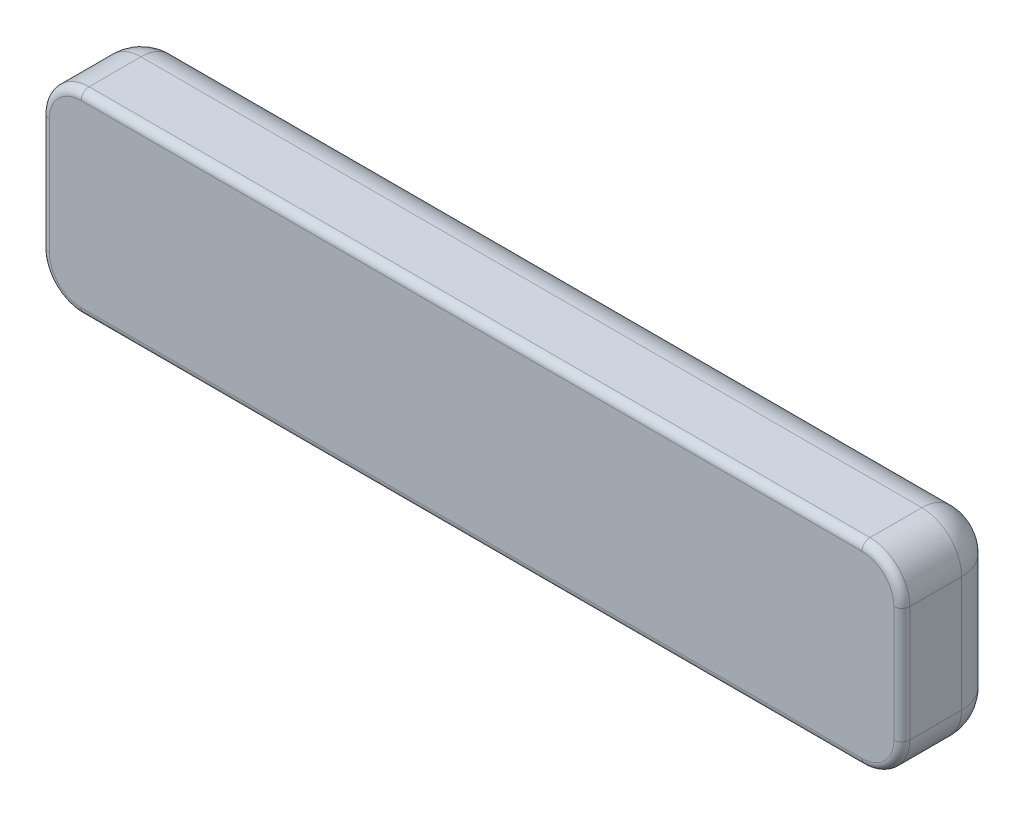
ISO-10303-21;
HEADER;
FILE_DESCRIPTION(('STEP AP214'),'2;1');
FILE_NAME('part.step','',(''),(''),'','','');
FILE_SCHEMA(('AUTOMOTIVE_DESIGN { 1 0 10303 214 1 1 1 1 }'));
ENDSEC;
DATA;
#1=APPLICATION_CONTEXT('core data for automotive mechanical design processes');
#2=APPLICATION_PROTOCOL_DEFINITION('international standard','automotive_design',2000,#1);
#3=PRODUCT_CONTEXT('',#1,'mechanical');
#4=PRODUCT('Part','Part','',(#3));
#5=PRODUCT_RELATED_PRODUCT_CATEGORY('part','',(#4));
#6=PRODUCT_DEFINITION_FORMATION('','',#4);
#7=PRODUCT_DEFINITION_CONTEXT('part definition',#1,'design');
#8=PRODUCT_DEFINITION('design','',#6,#7);
#9=PRODUCT_DEFINITION_SHAPE('','',#8);
#10=(LENGTH_UNIT() NAMED_UNIT(*) SI_UNIT(.MILLI.,.METRE.));
#11=(NAMED_UNIT(*) PLANE_ANGLE_UNIT() SI_UNIT($,.RADIAN.));
#12=(NAMED_UNIT(*) SI_UNIT($,.STERADIAN.) SOLID_ANGLE_UNIT());
#13=UNCERTAINTY_MEASURE_WITH_UNIT(LENGTH_MEASURE(1.E-05),#10,'distance_accuracy_value','');
#14=(GEOMETRIC_REPRESENTATION_CONTEXT(3) GLOBAL_UNCERTAINTY_ASSIGNED_CONTEXT((#13)) GLOBAL_UNIT_ASSIGNED_CONTEXT((#10,
#11,#12)) REPRESENTATION_CONTEXT('',''));
#15=CARTESIAN_POINT('',(0.,0.,0.));
#16=DIRECTION('',(0.,0.,1.));
#17=DIRECTION('',(1.,0.,0.));
#18=AXIS2_PLACEMENT_3D('',#15,#16,#17);
#19=CARTESIAN_POINT('',(54.,-12.25,12.5));
#20=DIRECTION('',(-1.,0.,0.));
#21=DIRECTION('',(0.,0.,1.));
#22=AXIS2_PLACEMENT_3D('',#19,#20,#21);
#23=PLANE('',#22);
#24=DIRECTION('',(0.,0.,-1.));
#25=VECTOR('',#24,1.);
#26=CARTESIAN_POINT('',(54.,7.25,12.5));
#27=LINE('',#26,#25);
#28=CARTESIAN_POINT('',(54.,7.25,5.));
#29=VERTEX_POINT('',#28);
#30=CARTESIAN_POINT('',(54.,7.25,11.5));
#31=VERTEX_POINT('',#30);
#32=EDGE_CURVE('E214',#29,#31,#27,.F.);
#33=ORIENTED_EDGE('',*,*,#32,.T.);
#34=DIRECTION('',(0.,1.,0.));
#35=VECTOR('',#34,1.);
#36=CARTESIAN_POINT('',(54.,-12.25,11.5));
#37=LINE('',#36,#35);
#38=CARTESIAN_POINT('',(54.,-7.25,11.5));
#39=VERTEX_POINT('',#38);
#40=EDGE_CURVE('E44',#31,#39,#37,.F.);
#41=ORIENTED_EDGE('',*,*,#40,.T.);
#42=DIRECTION('',(0.,0.,-1.));
#43=VECTOR('',#42,1.);
#44=CARTESIAN_POINT('',(54.,-7.25,12.5));
#45=LINE('',#44,#43);
#46=CARTESIAN_POINT('',(54.,-7.25,5.));
#47=VERTEX_POINT('',#46);
#48=EDGE_CURVE('E216',#39,#47,#45,.T.);
#49=ORIENTED_EDGE('',*,*,#48,.T.);
#50=DIRECTION('',(0.,1.,0.));
#51=VECTOR('',#50,1.);
#52=CARTESIAN_POINT('',(54.,12.25,5.));
#53=LINE('',#52,#51);
#54=EDGE_CURVE('E181',#47,#29,#53,.T.);
#55=ORIENTED_EDGE('',*,*,#54,.T.);
#56=EDGE_LOOP('',(#33,#41,#49,#55));
#57=FACE_BOUND('',#56,.T.);
#58=ADVANCED_FACE('F35',(#57),#23,.F.);
#59=CARTESIAN_POINT('',(-54.,12.25,12.5));
#60=DIRECTION('',(0.,-1.,0.));
#61=DIRECTION('',(0.,0.,-1.));
#62=AXIS2_PLACEMENT_3D('',#59,#60,#61);
#63=PLANE('',#62);
#64=DIRECTION('',(0.,0.,-1.));
#65=VECTOR('',#64,1.);
#66=CARTESIAN_POINT('',(-49.,12.25,12.5));
#67=LINE('',#66,#65);
#68=CARTESIAN_POINT('',(-49.,12.25,5.));
#69=VERTEX_POINT('',#68);
#70=CARTESIAN_POINT('',(-49.,12.25,11.5));
#71=VERTEX_POINT('',#70);
#72=EDGE_CURVE('E211',#69,#71,#67,.F.);
#73=ORIENTED_EDGE('',*,*,#72,.T.);
#74=DIRECTION('',(-1.,0.,0.));
#75=VECTOR('',#74,1.);
#76=CARTESIAN_POINT('',(-54.,12.25,11.5));
#77=LINE('',#76,#75);
#78=CARTESIAN_POINT('',(49.,12.25,11.5));
#79=VERTEX_POINT('',#78);
#80=EDGE_CURVE('E253',#71,#79,#77,.F.);
#81=ORIENTED_EDGE('',*,*,#80,.T.);
#82=DIRECTION('',(0.,0.,-1.));
#83=VECTOR('',#82,1.);
#84=CARTESIAN_POINT('',(49.,12.25,12.5));
#85=LINE('',#84,#83);
#86=CARTESIAN_POINT('',(49.,12.25,5.));
#87=VERTEX_POINT('',#86);
#88=EDGE_CURVE('E209',#79,#87,#85,.T.);
#89=ORIENTED_EDGE('',*,*,#88,.T.);
#90=DIRECTION('',(-1.,0.,0.));
#91=VECTOR('',#90,1.);
#92=CARTESIAN_POINT('',(-54.,12.25,5.));
#93=LINE('',#92,#91);
#94=EDGE_CURVE('E162',#87,#69,#93,.T.);
#95=ORIENTED_EDGE('',*,*,#94,.T.);
#96=EDGE_LOOP('',(#73,#81,#89,#95));
#97=FACE_BOUND('',#96,.T.);
#98=ADVANCED_FACE('F342',(#97),#63,.F.);
#99=CARTESIAN_POINT('',(-54.,-12.25,12.5));
#100=DIRECTION('',(1.,0.,0.));
#101=DIRECTION('',(0.,0.,-1.));
#102=AXIS2_PLACEMENT_3D('',#99,#100,#101);
#103=PLANE('',#102);
#104=DIRECTION('',(0.,0.,-1.));
#105=VECTOR('',#104,1.);
#106=CARTESIAN_POINT('',(-54.,-7.25,12.5));
#107=LINE('',#106,#105);
#108=CARTESIAN_POINT('',(-54.,-7.25,5.));
#109=VERTEX_POINT('',#108);
#110=CARTESIAN_POINT('',(-54.,-7.25,11.5));
#111=VERTEX_POINT('',#110);
#112=EDGE_CURVE('E206',#109,#111,#107,.F.);
#113=ORIENTED_EDGE('',*,*,#112,.T.);
#114=DIRECTION('',(0.,-1.,0.));
#115=VECTOR('',#114,1.);
#116=CARTESIAN_POINT('',(-54.,-12.25,11.5));
#117=LINE('',#116,#115);
#118=CARTESIAN_POINT('',(-54.,7.25,11.5));
#119=VERTEX_POINT('',#118);
#120=EDGE_CURVE('E247',#111,#119,#117,.F.);
#121=ORIENTED_EDGE('',*,*,#120,.T.);
#122=DIRECTION('',(0.,0.,-1.));
#123=VECTOR('',#122,1.);
#124=CARTESIAN_POINT('',(-54.,7.25,12.5));
#125=LINE('',#124,#123);
#126=CARTESIAN_POINT('',(-54.,7.25,5.));
#127=VERTEX_POINT('',#126);
#128=EDGE_CURVE('E204',#119,#127,#125,.T.);
#129=ORIENTED_EDGE('',*,*,#128,.T.);
#130=DIRECTION('',(0.,-1.,0.));
#131=VECTOR('',#130,1.);
#132=CARTESIAN_POINT('',(-54.,-12.25,5.));
#133=LINE('',#132,#131);
#134=EDGE_CURVE('E160',#127,#109,#133,.T.);
#135=ORIENTED_EDGE('',*,*,#134,.T.);
#136=EDGE_LOOP('',(#113,#121,#129,#135));
#137=FACE_BOUND('',#136,.T.);
#138=ADVANCED_FACE('F314',(#137),#103,.F.);
#139=CARTESIAN_POINT('',(-54.,-12.25,12.5));
#140=DIRECTION('',(0.,1.,0.));
#141=DIRECTION('',(0.,0.,1.));
#142=AXIS2_PLACEMENT_3D('',#139,#140,#141);
#143=PLANE('',#142);
#144=DIRECTION('',(0.,0.,-1.));
#145=VECTOR('',#144,1.);
#146=CARTESIAN_POINT('',(49.,-12.25,12.5));
#147=LINE('',#146,#145);
#148=CARTESIAN_POINT('',(49.,-12.25,5.));
#149=VERTEX_POINT('',#148);
#150=CARTESIAN_POINT('',(49.,-12.25,11.5));
#151=VERTEX_POINT('',#150);
#152=EDGE_CURVE('E199',#149,#151,#147,.F.);
#153=ORIENTED_EDGE('',*,*,#152,.T.);
#154=DIRECTION('',(1.,0.,0.));
#155=VECTOR('',#154,1.);
#156=CARTESIAN_POINT('',(-54.,-12.25,11.5));
#157=LINE('',#156,#155);
#158=CARTESIAN_POINT('',(-49.,-12.25,11.5));
#159=VERTEX_POINT('',#158);
#160=EDGE_CURVE('E251',#151,#159,#157,.F.);
#161=ORIENTED_EDGE('',*,*,#160,.T.);
#162=DIRECTION('',(0.,0.,-1.));
#163=VECTOR('',#162,1.);
#164=CARTESIAN_POINT('',(-49.,-12.25,12.5));
#165=LINE('',#164,#163);
#166=CARTESIAN_POINT('',(-49.,-12.25,5.));
#167=VERTEX_POINT('',#166);
#168=EDGE_CURVE('E202',#159,#167,#165,.T.);
#169=ORIENTED_EDGE('',*,*,#168,.T.);
#170=DIRECTION('',(1.,0.,0.));
#171=VECTOR('',#170,1.);
#172=CARTESIAN_POINT('',(54.,-12.25,5.));
#173=LINE('',#172,#171);
#174=EDGE_CURVE('E178',#167,#149,#173,.T.);
#175=ORIENTED_EDGE('',*,*,#174,.T.);
#176=EDGE_LOOP('',(#153,#161,#169,#175));
#177=FACE_BOUND('',#176,.T.);
#178=ADVANCED_FACE('F299',(#177),#143,.F.);
#179=CARTESIAN_POINT('',(0.,0.,12.5));
#180=DIRECTION('',(0.,0.,-1.));
#181=DIRECTION('',(-1.,0.,0.));
#182=AXIS2_PLACEMENT_3D('',#179,#180,#181);
#183=PLANE('',#182);
#184=DIRECTION('',(0.,-1.,0.));
#185=VECTOR('',#184,1.);
#186=CARTESIAN_POINT('',(-53.,0.,12.5));
#187=LINE('',#186,#185);
#188=CARTESIAN_POINT('',(-53.,7.25,12.5));
#189=VERTEX_POINT('',#188);
#190=CARTESIAN_POINT('',(-53.,-7.25,12.5));
#191=VERTEX_POINT('',#190);
#192=EDGE_CURVE('E239',#189,#191,#187,.T.);
#193=ORIENTED_EDGE('',*,*,#192,.T.);
#194=CARTESIAN_POINT('',(-49.,-7.25,12.5));
#195=DIRECTION('',(0.,0.,-1.));
#196=DIRECTION('',(-1.,0.,0.));
#197=AXIS2_PLACEMENT_3D('',#194,#195,#196);
#198=CIRCLE('',#197,4.);
#199=CARTESIAN_POINT('',(-49.,-11.25,12.5));
#200=VERTEX_POINT('',#199);
#201=EDGE_CURVE('E241',#191,#200,#198,.F.);
#202=ORIENTED_EDGE('',*,*,#201,.T.);
#203=DIRECTION('',(1.,0.,0.));
#204=VECTOR('',#203,1.);
#205=CARTESIAN_POINT('',(0.,-11.25,12.5));
#206=LINE('',#205,#204);
#207=CARTESIAN_POINT('',(49.,-11.25,12.5));
#208=VERTEX_POINT('',#207);
#209=EDGE_CURVE('E235',#200,#208,#206,.T.);
#210=ORIENTED_EDGE('',*,*,#209,.T.);
#211=CARTESIAN_POINT('',(49.,-7.25,12.5));
#212=DIRECTION('',(0.,0.,-1.));
#213=DIRECTION('',(-1.,0.,0.));
#214=AXIS2_PLACEMENT_3D('',#211,#212,#213);
#215=CIRCLE('',#214,4.);
#216=CARTESIAN_POINT('',(53.,-7.25,12.5));
#217=VERTEX_POINT('',#216);
#218=EDGE_CURVE('E218',#208,#217,#215,.F.);
#219=ORIENTED_EDGE('',*,*,#218,.T.);
#220=DIRECTION('',(0.,1.,0.));
#221=VECTOR('',#220,1.);
#222=CARTESIAN_POINT('',(53.,0.,12.5));
#223=LINE('',#222,#221);
#224=CARTESIAN_POINT('',(53.,7.25,12.5));
#225=VERTEX_POINT('',#224);
#226=EDGE_CURVE('E229',#217,#225,#223,.T.);
#227=ORIENTED_EDGE('',*,*,#226,.T.);
#228=CARTESIAN_POINT('',(49.,7.25,12.5));
#229=DIRECTION('',(0.,0.,-1.));
#230=DIRECTION('',(-1.,0.,0.));
#231=AXIS2_PLACEMENT_3D('',#228,#229,#230);
#232=CIRCLE('',#231,4.);
#233=CARTESIAN_POINT('',(49.,11.25,12.5));
#234=VERTEX_POINT('',#233);
#235=EDGE_CURVE('E231',#225,#234,#232,.F.);
#236=ORIENTED_EDGE('',*,*,#235,.T.);
#237=DIRECTION('',(-1.,0.,0.));
#238=VECTOR('',#237,1.);
#239=CARTESIAN_POINT('',(0.,11.25,12.5));
#240=LINE('',#239,#238);
#241=CARTESIAN_POINT('',(-49.,11.25,12.5));
#242=VERTEX_POINT('',#241);
#243=EDGE_CURVE('E233',#234,#242,#240,.T.);
#244=ORIENTED_EDGE('',*,*,#243,.T.);
#245=CARTESIAN_POINT('',(-49.,7.25,12.5));
#246=DIRECTION('',(0.,0.,-1.));
#247=DIRECTION('',(-1.,0.,0.));
#248=AXIS2_PLACEMENT_3D('',#245,#246,#247);
#249=CIRCLE('',#248,4.);
#250=EDGE_CURVE('E237',#242,#189,#249,.F.);
#251=ORIENTED_EDGE('',*,*,#250,.T.);
#252=EDGE_LOOP('',(#193,#202,#210,#219,#227,#236,#244,#251));
#253=FACE_BOUND('',#252,.T.);
#254=ADVANCED_FACE('F470',(#253),#183,.F.);
#255=CARTESIAN_POINT('',(0.,0.,0.));
#256=DIRECTION('',(0.,0.,-1.));
#257=DIRECTION('',(-1.,0.,0.));
#258=AXIS2_PLACEMENT_3D('',#255,#256,#257);
#259=PLANE('',#258);
#260=CARTESIAN_POINT('',(25.,0.,0.));
#261=DIRECTION('',(0.,0.,-1.));
#262=DIRECTION('',(-1.,0.,0.));
#263=AXIS2_PLACEMENT_3D('',#260,#261,#262);
#264=CIRCLE('',#263,1.8);
#265=CARTESIAN_POINT('',(23.2,0.,0.));
#266=VERTEX_POINT('',#265);
#267=EDGE_CURVE('E319',#266,#266,#264,.T.);
#268=ORIENTED_EDGE('',*,*,#267,.F.);
#269=EDGE_LOOP('',(#268));
#270=FACE_BOUND('',#269,.T.);
#271=CARTESIAN_POINT('',(-25.,0.,0.));
#272=DIRECTION('',(0.,0.,-1.));
#273=DIRECTION('',(-1.,0.,0.));
#274=AXIS2_PLACEMENT_3D('',#271,#272,#273);
#275=CIRCLE('',#274,1.8);
#276=CARTESIAN_POINT('',(-26.8,0.,0.));
#277=VERTEX_POINT('',#276);
#278=EDGE_CURVE('E221',#277,#277,#275,.T.);
#279=ORIENTED_EDGE('',*,*,#278,.F.);
#280=EDGE_LOOP('',(#279));
#281=FACE_BOUND('',#280,.T.);
#282=DIRECTION('',(1.,0.,0.));
#283=VECTOR('',#282,1.);
#284=CARTESIAN_POINT('',(-54.,-7.25,0.));
#285=LINE('',#284,#283);
#286=CARTESIAN_POINT('',(49.,-7.25,0.));
#287=VERTEX_POINT('',#286);
#288=CARTESIAN_POINT('',(-49.,-7.25,0.));
#289=VERTEX_POINT('',#288);
#290=EDGE_CURVE('E177',#287,#289,#285,.F.);
#291=ORIENTED_EDGE('',*,*,#290,.T.);
#292=DIRECTION('',(0.,-1.,0.));
#293=VECTOR('',#292,1.);
#294=CARTESIAN_POINT('',(-49.,12.25,0.));
#295=LINE('',#294,#293);
#296=CARTESIAN_POINT('',(-49.,7.25,0.));
#297=VERTEX_POINT('',#296);
#298=EDGE_CURVE('E157',#289,#297,#295,.F.);
#299=ORIENTED_EDGE('',*,*,#298,.T.);
#300=DIRECTION('',(-1.,0.,0.));
#301=VECTOR('',#300,1.);
#302=CARTESIAN_POINT('',(54.,7.25,0.));
#303=LINE('',#302,#301);
#304=CARTESIAN_POINT('',(49.,7.25,0.));
#305=VERTEX_POINT('',#304);
#306=EDGE_CURVE('E166',#297,#305,#303,.F.);
#307=ORIENTED_EDGE('',*,*,#306,.T.);
#308=DIRECTION('',(0.,1.,0.));
#309=VECTOR('',#308,1.);
#310=CARTESIAN_POINT('',(49.,-12.25,0.));
#311=LINE('',#310,#309);
#312=EDGE_CURVE('E172',#305,#287,#311,.F.);
#313=ORIENTED_EDGE('',*,*,#312,.T.);
#314=EDGE_LOOP('',(#291,#299,#307,#313));
#315=FACE_BOUND('',#314,.T.);
#316=ADVANCED_FACE('F175',(#270,#281,#315),#259,.T.);
#317=CARTESIAN_POINT('',(49.,-12.25,5.));
#318=DIRECTION('',(0.,-1.,0.));
#319=DIRECTION('',(0.,0.,-1.));
#320=AXIS2_PLACEMENT_3D('',#317,#318,#319);
#321=CYLINDRICAL_SURFACE('',#320,5.);
#322=ORIENTED_EDGE('',*,*,#54,.F.);
#323=CARTESIAN_POINT('',(49.,-7.25,5.));
#324=DIRECTION('',(0.,-1.,0.));
#325=DIRECTION('',(0.,0.,-1.));
#326=AXIS2_PLACEMENT_3D('',#323,#324,#325);
#327=CIRCLE('',#326,5.);
#328=EDGE_CURVE('E197',#47,#287,#327,.F.);
#329=ORIENTED_EDGE('',*,*,#328,.T.);
#330=ORIENTED_EDGE('',*,*,#312,.F.);
#331=CARTESIAN_POINT('',(49.,7.25,5.));
#332=DIRECTION('',(0.,-1.,0.));
#333=DIRECTION('',(0.,0.,-1.));
#334=AXIS2_PLACEMENT_3D('',#331,#332,#333);
#335=CIRCLE('',#334,5.);
#336=EDGE_CURVE('E148',#305,#29,#335,.T.);
#337=ORIENTED_EDGE('',*,*,#336,.T.);
#338=EDGE_LOOP('',(#322,#329,#330,#337));
#339=FACE_BOUND('',#338,.T.);
#340=ADVANCED_FACE('F328',(#339),#321,.T.);
#341=CARTESIAN_POINT('',(-54.,7.25,5.));
#342=DIRECTION('',(1.,0.,0.));
#343=DIRECTION('',(0.,0.,-1.));
#344=AXIS2_PLACEMENT_3D('',#341,#342,#343);
#345=CYLINDRICAL_SURFACE('',#344,5.);
#346=ORIENTED_EDGE('',*,*,#306,.F.);
#347=CARTESIAN_POINT('',(-49.,7.25,5.));
#348=DIRECTION('',(1.,0.,0.));
#349=DIRECTION('',(0.,0.,-1.));
#350=AXIS2_PLACEMENT_3D('',#347,#348,#349);
#351=CIRCLE('',#350,5.);
#352=EDGE_CURVE('E138',#297,#69,#351,.T.);
#353=ORIENTED_EDGE('',*,*,#352,.T.);
#354=ORIENTED_EDGE('',*,*,#94,.F.);
#355=CARTESIAN_POINT('',(49.,7.25,5.));
#356=DIRECTION('',(1.,0.,0.));
#357=DIRECTION('',(0.,0.,-1.));
#358=AXIS2_PLACEMENT_3D('',#355,#356,#357);
#359=CIRCLE('',#358,5.);
#360=EDGE_CURVE('E149',#87,#305,#359,.F.);
#361=ORIENTED_EDGE('',*,*,#360,.T.);
#362=EDGE_LOOP('',(#346,#353,#354,#361));
#363=FACE_BOUND('',#362,.T.);
#364=ADVANCED_FACE('F167',(#363),#345,.T.);
#365=CARTESIAN_POINT('',(-54.,-7.25,5.));
#366=DIRECTION('',(-1.,0.,0.));
#367=DIRECTION('',(0.,0.,1.));
#368=AXIS2_PLACEMENT_3D('',#365,#366,#367);
#369=CYLINDRICAL_SURFACE('',#368,5.);
#370=ORIENTED_EDGE('',*,*,#174,.F.);
#371=CARTESIAN_POINT('',(-49.,-7.25,5.));
#372=DIRECTION('',(-1.,0.,0.));
#373=DIRECTION('',(0.,0.,1.));
#374=AXIS2_PLACEMENT_3D('',#371,#372,#373);
#375=CIRCLE('',#374,5.);
#376=EDGE_CURVE('E193',#167,#289,#375,.F.);
#377=ORIENTED_EDGE('',*,*,#376,.T.);
#378=ORIENTED_EDGE('',*,*,#290,.F.);
#379=CARTESIAN_POINT('',(49.,-7.25,5.));
#380=DIRECTION('',(-1.,0.,0.));
#381=DIRECTION('',(0.,0.,1.));
#382=AXIS2_PLACEMENT_3D('',#379,#380,#381);
#383=CIRCLE('',#382,5.);
#384=EDGE_CURVE('E190',#287,#149,#383,.T.);
#385=ORIENTED_EDGE('',*,*,#384,.T.);
#386=EDGE_LOOP('',(#370,#377,#378,#385));
#387=FACE_BOUND('',#386,.T.);
#388=ADVANCED_FACE('F304',(#387),#369,.T.);
#389=CARTESIAN_POINT('',(-49.,-12.25,5.));
#390=DIRECTION('',(0.,1.,0.));
#391=DIRECTION('',(0.,0.,1.));
#392=AXIS2_PLACEMENT_3D('',#389,#390,#391);
#393=CYLINDRICAL_SURFACE('',#392,5.);
#394=ORIENTED_EDGE('',*,*,#298,.F.);
#395=CARTESIAN_POINT('',(-49.,-7.25,5.));
#396=DIRECTION('',(0.,1.,0.));
#397=DIRECTION('',(0.,0.,1.));
#398=AXIS2_PLACEMENT_3D('',#395,#396,#397);
#399=CIRCLE('',#398,5.);
#400=EDGE_CURVE('E161',#289,#109,#399,.T.);
#401=ORIENTED_EDGE('',*,*,#400,.T.);
#402=ORIENTED_EDGE('',*,*,#134,.F.);
#403=CARTESIAN_POINT('',(-49.,7.25,5.));
#404=DIRECTION('',(0.,1.,0.));
#405=DIRECTION('',(0.,0.,1.));
#406=AXIS2_PLACEMENT_3D('',#403,#404,#405);
#407=CIRCLE('',#406,5.);
#408=EDGE_CURVE('E141',#127,#297,#407,.F.);
#409=ORIENTED_EDGE('',*,*,#408,.T.);
#410=EDGE_LOOP('',(#394,#401,#402,#409));
#411=FACE_BOUND('',#410,.T.);
#412=ADVANCED_FACE('F154',(#411),#393,.T.);
#413=CARTESIAN_POINT('',(-25.,0.,5.));
#414=DIRECTION('',(0.,0.,-1.));
#415=DIRECTION('',(-1.,0.,0.));
#416=AXIS2_PLACEMENT_3D('',#413,#414,#415);
#417=CYLINDRICAL_SURFACE('',#416,1.8);
#418=CARTESIAN_POINT('',(-25.,0.,5.));
#419=DIRECTION('',(0.,0.,-1.));
#420=DIRECTION('',(-1.,0.,0.));
#421=AXIS2_PLACEMENT_3D('',#418,#419,#420);
#422=CIRCLE('',#421,1.8);
#423=CARTESIAN_POINT('',(-26.8,0.,5.));
#424=VERTEX_POINT('',#423);
#425=EDGE_CURVE('E615',#424,#424,#422,.T.);
#426=ORIENTED_EDGE('',*,*,#425,.F.);
#427=EDGE_LOOP('',(#426));
#428=FACE_BOUND('',#427,.T.);
#429=ORIENTED_EDGE('',*,*,#278,.T.);
#430=EDGE_LOOP('',(#429));
#431=FACE_BOUND('',#430,.T.);
#432=ADVANCED_FACE('F353',(#428,#431),#417,.F.);
#433=CARTESIAN_POINT('',(-25.,0.,5.));
#434=DIRECTION('',(0.,0.,-1.));
#435=DIRECTION('',(-1.,0.,0.));
#436=AXIS2_PLACEMENT_3D('',#433,#434,#435);
#437=PLANE('',#436);
#438=ORIENTED_EDGE('',*,*,#425,.T.);
#439=EDGE_LOOP('',(#438));
#440=FACE_BOUND('',#439,.T.);
#441=ADVANCED_FACE('F593',(#440),#437,.T.);
#442=CARTESIAN_POINT('',(25.,0.,5.));
#443=DIRECTION('',(0.,0.,-1.));
#444=DIRECTION('',(-1.,0.,0.));
#445=AXIS2_PLACEMENT_3D('',#442,#443,#444);
#446=CYLINDRICAL_SURFACE('',#445,1.8);
#447=CARTESIAN_POINT('',(25.,0.,5.));
#448=DIRECTION('',(0.,0.,-1.));
#449=DIRECTION('',(-1.,0.,0.));
#450=AXIS2_PLACEMENT_3D('',#447,#448,#449);
#451=CIRCLE('',#450,1.8);
#452=CARTESIAN_POINT('',(23.2,0.,5.));
#453=VERTEX_POINT('',#452);
#454=EDGE_CURVE('E316',#453,#453,#451,.T.);
#455=ORIENTED_EDGE('',*,*,#454,.F.);
#456=EDGE_LOOP('',(#455));
#457=FACE_BOUND('',#456,.T.);
#458=ORIENTED_EDGE('',*,*,#267,.T.);
#459=EDGE_LOOP('',(#458));
#460=FACE_BOUND('',#459,.T.);
#461=ADVANCED_FACE('F583',(#457,#460),#446,.F.);
#462=CARTESIAN_POINT('',(25.,0.,5.));
#463=DIRECTION('',(0.,0.,-1.));
#464=DIRECTION('',(-1.,0.,0.));
#465=AXIS2_PLACEMENT_3D('',#462,#463,#464);
#466=PLANE('',#465);
#467=ORIENTED_EDGE('',*,*,#454,.T.);
#468=EDGE_LOOP('',(#467));
#469=FACE_BOUND('',#468,.T.);
#470=ADVANCED_FACE('F365',(#469),#466,.T.);
#471=CARTESIAN_POINT('',(-49.,-7.25,12.5));
#472=DIRECTION('',(0.,0.,-1.));
#473=DIRECTION('',(-1.,0.,0.));
#474=AXIS2_PLACEMENT_3D('',#471,#472,#473);
#475=CYLINDRICAL_SURFACE('',#474,5.);
#476=ORIENTED_EDGE('',*,*,#168,.F.);
#477=CARTESIAN_POINT('',(-49.,-7.25,11.5));
#478=DIRECTION('',(0.,0.,-1.));
#479=DIRECTION('',(-1.,0.,0.));
#480=AXIS2_PLACEMENT_3D('',#477,#478,#479);
#481=CIRCLE('',#480,5.);
#482=EDGE_CURVE('E244',#159,#111,#481,.T.);
#483=ORIENTED_EDGE('',*,*,#482,.T.);
#484=ORIENTED_EDGE('',*,*,#112,.F.);
#485=CARTESIAN_POINT('',(-49.,-7.25,5.));
#486=DIRECTION('',(0.,0.,-1.));
#487=DIRECTION('',(-1.,0.,0.));
#488=AXIS2_PLACEMENT_3D('',#485,#486,#487);
#489=CIRCLE('',#488,5.);
#490=EDGE_CURVE('E219',#167,#109,#489,.T.);
#491=ORIENTED_EDGE('',*,*,#490,.F.);
#492=EDGE_LOOP('',(#476,#483,#484,#491));
#493=FACE_BOUND('',#492,.T.);
#494=ADVANCED_FACE('F311',(#493),#475,.T.);
#495=CARTESIAN_POINT('',(-49.,-7.25,5.));
#496=DIRECTION('',(0.,0.,1.));
#497=DIRECTION('',(1.,0.,0.));
#498=AXIS2_PLACEMENT_3D('',#495,#496,#497);
#499=SPHERICAL_SURFACE('',#498,5.);
#500=ORIENTED_EDGE('',*,*,#400,.F.);
#501=ORIENTED_EDGE('',*,*,#376,.F.);
#502=ORIENTED_EDGE('',*,*,#490,.T.);
#503=EDGE_LOOP('',(#500,#501,#502));
#504=FACE_BOUND('',#503,.T.);
#505=ADVANCED_FACE('F308',(#504),#499,.T.);
#506=CARTESIAN_POINT('',(-49.,7.25,12.5));
#507=DIRECTION('',(0.,0.,-1.));
#508=DIRECTION('',(-1.,0.,0.));
#509=AXIS2_PLACEMENT_3D('',#506,#507,#508);
#510=CYLINDRICAL_SURFACE('',#509,5.);
#511=ORIENTED_EDGE('',*,*,#128,.F.);
#512=CARTESIAN_POINT('',(-49.,7.25,11.5));
#513=DIRECTION('',(0.,0.,-1.));
#514=DIRECTION('',(-1.,0.,0.));
#515=AXIS2_PLACEMENT_3D('',#512,#513,#514);
#516=CIRCLE('',#515,5.);
#517=EDGE_CURVE('E249',#119,#71,#516,.T.);
#518=ORIENTED_EDGE('',*,*,#517,.T.);
#519=ORIENTED_EDGE('',*,*,#72,.F.);
#520=CARTESIAN_POINT('',(-49.,7.25,5.));
#521=DIRECTION('',(0.,0.,-1.));
#522=DIRECTION('',(-1.,0.,0.));
#523=AXIS2_PLACEMENT_3D('',#520,#521,#522);
#524=CIRCLE('',#523,5.);
#525=EDGE_CURVE('E143',#127,#69,#524,.T.);
#526=ORIENTED_EDGE('',*,*,#525,.F.);
#527=EDGE_LOOP('',(#511,#518,#519,#526));
#528=FACE_BOUND('',#527,.T.);
#529=ADVANCED_FACE('F362',(#528),#510,.T.);
#530=CARTESIAN_POINT('',(-49.,7.25,5.));
#531=DIRECTION('',(0.,0.,1.));
#532=DIRECTION('',(1.,0.,0.));
#533=AXIS2_PLACEMENT_3D('',#530,#531,#532);
#534=SPHERICAL_SURFACE('',#533,5.);
#535=ORIENTED_EDGE('',*,*,#525,.T.);
#536=ORIENTED_EDGE('',*,*,#352,.F.);
#537=ORIENTED_EDGE('',*,*,#408,.F.);
#538=EDGE_LOOP('',(#535,#536,#537));
#539=FACE_BOUND('',#538,.T.);
#540=ADVANCED_FACE('F140',(#539),#534,.T.);
#541=CARTESIAN_POINT('',(49.,-7.25,12.5));
#542=DIRECTION('',(0.,0.,-1.));
#543=DIRECTION('',(-1.,0.,0.));
#544=AXIS2_PLACEMENT_3D('',#541,#542,#543);
#545=CYLINDRICAL_SURFACE('',#544,5.);
#546=ORIENTED_EDGE('',*,*,#48,.F.);
#547=CARTESIAN_POINT('',(49.,-7.25,11.5));
#548=DIRECTION('',(0.,0.,-1.));
#549=DIRECTION('',(-1.,0.,0.));
#550=AXIS2_PLACEMENT_3D('',#547,#548,#549);
#551=CIRCLE('',#550,5.);
#552=EDGE_CURVE('E11',#39,#151,#551,.T.);
#553=ORIENTED_EDGE('',*,*,#552,.T.);
#554=ORIENTED_EDGE('',*,*,#152,.F.);
#555=CARTESIAN_POINT('',(49.,-7.25,5.));
#556=DIRECTION('',(0.,0.,-1.));
#557=DIRECTION('',(-1.,0.,0.));
#558=AXIS2_PLACEMENT_3D('',#555,#556,#557);
#559=CIRCLE('',#558,5.);
#560=EDGE_CURVE('E223',#47,#149,#559,.T.);
#561=ORIENTED_EDGE('',*,*,#560,.F.);
#562=EDGE_LOOP('',(#546,#553,#554,#561));
#563=FACE_BOUND('',#562,.T.);
#564=ADVANCED_FACE('F296',(#563),#545,.T.);
#565=CARTESIAN_POINT('',(49.,-7.25,5.));
#566=DIRECTION('',(0.,0.,1.));
#567=DIRECTION('',(1.,0.,0.));
#568=AXIS2_PLACEMENT_3D('',#565,#566,#567);
#569=SPHERICAL_SURFACE('',#568,5.);
#570=ORIENTED_EDGE('',*,*,#384,.F.);
#571=ORIENTED_EDGE('',*,*,#328,.F.);
#572=ORIENTED_EDGE('',*,*,#560,.T.);
#573=EDGE_LOOP('',(#570,#571,#572));
#574=FACE_BOUND('',#573,.T.);
#575=ADVANCED_FACE('F326',(#574),#569,.T.);
#576=CARTESIAN_POINT('',(49.,7.25,12.5));
#577=DIRECTION('',(0.,0.,-1.));
#578=DIRECTION('',(-1.,0.,0.));
#579=AXIS2_PLACEMENT_3D('',#576,#577,#578);
#580=CYLINDRICAL_SURFACE('',#579,5.);
#581=ORIENTED_EDGE('',*,*,#88,.F.);
#582=CARTESIAN_POINT('',(49.,7.25,11.5));
#583=DIRECTION('',(0.,0.,-1.));
#584=DIRECTION('',(-1.,0.,0.));
#585=AXIS2_PLACEMENT_3D('',#582,#583,#584);
#586=CIRCLE('',#585,5.);
#587=EDGE_CURVE('E59',#79,#31,#586,.T.);
#588=ORIENTED_EDGE('',*,*,#587,.T.);
#589=ORIENTED_EDGE('',*,*,#32,.F.);
#590=CARTESIAN_POINT('',(49.,7.25,5.));
#591=DIRECTION('',(0.,0.,-1.));
#592=DIRECTION('',(-1.,0.,0.));
#593=AXIS2_PLACEMENT_3D('',#590,#591,#592);
#594=CIRCLE('',#593,5.);
#595=EDGE_CURVE('E225',#87,#29,#594,.T.);
#596=ORIENTED_EDGE('',*,*,#595,.F.);
#597=EDGE_LOOP('',(#581,#588,#589,#596));
#598=FACE_BOUND('',#597,.T.);
#599=ADVANCED_FACE('F330',(#598),#580,.T.);
#600=CARTESIAN_POINT('',(49.,7.25,5.));
#601=DIRECTION('',(0.,0.,1.));
#602=DIRECTION('',(1.,0.,0.));
#603=AXIS2_PLACEMENT_3D('',#600,#601,#602);
#604=SPHERICAL_SURFACE('',#603,5.);
#605=ORIENTED_EDGE('',*,*,#595,.T.);
#606=ORIENTED_EDGE('',*,*,#336,.F.);
#607=ORIENTED_EDGE('',*,*,#360,.F.);
#608=EDGE_LOOP('',(#605,#606,#607));
#609=FACE_BOUND('',#608,.T.);
#610=ADVANCED_FACE('F332',(#609),#604,.T.);
#611=CARTESIAN_POINT('',(49.,7.25,11.5));
#612=DIRECTION('',(0.,0.,-1.));
#613=DIRECTION('',(-1.,0.,0.));
#614=AXIS2_PLACEMENT_3D('',#611,#612,#613);
#615=TOROIDAL_SURFACE('',#614,4.,1.);
#616=CARTESIAN_POINT('',(53.,7.25,11.5));
#617=DIRECTION('',(0.,-1.,0.));
#618=DIRECTION('',(0.,0.,-1.));
#619=AXIS2_PLACEMENT_3D('',#616,#617,#618);
#620=CIRCLE('',#619,1.);
#621=EDGE_CURVE('E272',#31,#225,#620,.T.);
#622=ORIENTED_EDGE('',*,*,#621,.F.);
#623=ORIENTED_EDGE('',*,*,#587,.F.);
#624=CARTESIAN_POINT('',(49.,11.25,11.5));
#625=DIRECTION('',(-1.,0.,0.));
#626=DIRECTION('',(0.,0.,1.));
#627=AXIS2_PLACEMENT_3D('',#624,#625,#626);
#628=CIRCLE('',#627,1.);
#629=EDGE_CURVE('E39',#234,#79,#628,.T.);
#630=ORIENTED_EDGE('',*,*,#629,.F.);
#631=ORIENTED_EDGE('',*,*,#235,.F.);
#632=EDGE_LOOP('',(#622,#623,#630,#631));
#633=FACE_BOUND('',#632,.T.);
#634=ADVANCED_FACE('F37',(#633),#615,.T.);
#635=CARTESIAN_POINT('',(0.,11.25,11.5));
#636=DIRECTION('',(-1.,0.,0.));
#637=DIRECTION('',(0.,0.,1.));
#638=AXIS2_PLACEMENT_3D('',#635,#636,#637);
#639=CYLINDRICAL_SURFACE('',#638,1.);
#640=ORIENTED_EDGE('',*,*,#629,.T.);
#641=ORIENTED_EDGE('',*,*,#80,.F.);
#642=CARTESIAN_POINT('',(-49.,11.25,11.5));
#643=DIRECTION('',(-1.,0.,0.));
#644=DIRECTION('',(0.,0.,1.));
#645=AXIS2_PLACEMENT_3D('',#642,#643,#644);
#646=CIRCLE('',#645,1.);
#647=EDGE_CURVE('E270',#242,#71,#646,.T.);
#648=ORIENTED_EDGE('',*,*,#647,.F.);
#649=ORIENTED_EDGE('',*,*,#243,.F.);
#650=EDGE_LOOP('',(#640,#641,#648,#649));
#651=FACE_BOUND('',#650,.T.);
#652=ADVANCED_FACE('F282',(#651),#639,.T.);
#653=CARTESIAN_POINT('',(53.,0.,11.5));
#654=DIRECTION('',(0.,1.,0.));
#655=DIRECTION('',(0.,0.,1.));
#656=AXIS2_PLACEMENT_3D('',#653,#654,#655);
#657=CYLINDRICAL_SURFACE('',#656,1.);
#658=ORIENTED_EDGE('',*,*,#621,.T.);
#659=ORIENTED_EDGE('',*,*,#226,.F.);
#660=CARTESIAN_POINT('',(53.,-7.25,11.5));
#661=DIRECTION('',(0.,-1.,0.));
#662=DIRECTION('',(0.,0.,-1.));
#663=AXIS2_PLACEMENT_3D('',#660,#661,#662);
#664=CIRCLE('',#663,1.);
#665=EDGE_CURVE('E267',#39,#217,#664,.T.);
#666=ORIENTED_EDGE('',*,*,#665,.F.);
#667=ORIENTED_EDGE('',*,*,#40,.F.);
#668=EDGE_LOOP('',(#658,#659,#666,#667));
#669=FACE_BOUND('',#668,.T.);
#670=ADVANCED_FACE('F287',(#669),#657,.T.);
#671=CARTESIAN_POINT('',(-49.,7.25,11.5));
#672=DIRECTION('',(0.,0.,-1.));
#673=DIRECTION('',(-1.,0.,0.));
#674=AXIS2_PLACEMENT_3D('',#671,#672,#673);
#675=TOROIDAL_SURFACE('',#674,4.,1.);
#676=ORIENTED_EDGE('',*,*,#647,.T.);
#677=ORIENTED_EDGE('',*,*,#517,.F.);
#678=CARTESIAN_POINT('',(-53.,7.25,11.5));
#679=DIRECTION('',(0.,-1.,0.));
#680=DIRECTION('',(0.,0.,-1.));
#681=AXIS2_PLACEMENT_3D('',#678,#679,#680);
#682=CIRCLE('',#681,1.);
#683=EDGE_CURVE('E264',#189,#119,#682,.T.);
#684=ORIENTED_EDGE('',*,*,#683,.F.);
#685=ORIENTED_EDGE('',*,*,#250,.F.);
#686=EDGE_LOOP('',(#676,#677,#684,#685));
#687=FACE_BOUND('',#686,.T.);
#688=ADVANCED_FACE('F409',(#687),#675,.T.);
#689=CARTESIAN_POINT('',(49.,-7.25,11.5));
#690=DIRECTION('',(0.,0.,-1.));
#691=DIRECTION('',(-1.,0.,0.));
#692=AXIS2_PLACEMENT_3D('',#689,#690,#691);
#693=TOROIDAL_SURFACE('',#692,4.,1.);
#694=ORIENTED_EDGE('',*,*,#665,.T.);
#695=ORIENTED_EDGE('',*,*,#218,.F.);
#696=CARTESIAN_POINT('',(49.,-11.25,11.5));
#697=DIRECTION('',(-1.,0.,0.));
#698=DIRECTION('',(0.,0.,1.));
#699=AXIS2_PLACEMENT_3D('',#696,#697,#698);
#700=CIRCLE('',#699,1.);
#701=EDGE_CURVE('E261',#151,#208,#700,.T.);
#702=ORIENTED_EDGE('',*,*,#701,.F.);
#703=ORIENTED_EDGE('',*,*,#552,.F.);
#704=EDGE_LOOP('',(#694,#695,#702,#703));
#705=FACE_BOUND('',#704,.T.);
#706=ADVANCED_FACE('F292',(#705),#693,.T.);
#707=CARTESIAN_POINT('',(-53.,0.,11.5));
#708=DIRECTION('',(0.,-1.,0.));
#709=DIRECTION('',(0.,0.,-1.));
#710=AXIS2_PLACEMENT_3D('',#707,#708,#709);
#711=CYLINDRICAL_SURFACE('',#710,1.);
#712=ORIENTED_EDGE('',*,*,#683,.T.);
#713=ORIENTED_EDGE('',*,*,#120,.F.);
#714=CARTESIAN_POINT('',(-53.,-7.25,11.5));
#715=DIRECTION('',(0.,-1.,0.));
#716=DIRECTION('',(0.,0.,-1.));
#717=AXIS2_PLACEMENT_3D('',#714,#715,#716);
#718=CIRCLE('',#717,1.);
#719=EDGE_CURVE('E259',#191,#111,#718,.T.);
#720=ORIENTED_EDGE('',*,*,#719,.F.);
#721=ORIENTED_EDGE('',*,*,#192,.F.);
#722=EDGE_LOOP('',(#712,#713,#720,#721));
#723=FACE_BOUND('',#722,.T.);
#724=ADVANCED_FACE('F427',(#723),#711,.T.);
#725=CARTESIAN_POINT('',(0.,-11.25,11.5));
#726=DIRECTION('',(1.,0.,0.));
#727=DIRECTION('',(0.,0.,-1.));
#728=AXIS2_PLACEMENT_3D('',#725,#726,#727);
#729=CYLINDRICAL_SURFACE('',#728,1.);
#730=ORIENTED_EDGE('',*,*,#701,.T.);
#731=ORIENTED_EDGE('',*,*,#209,.F.);
#732=CARTESIAN_POINT('',(-49.,-11.25,11.5));
#733=DIRECTION('',(-1.,0.,0.));
#734=DIRECTION('',(0.,0.,1.));
#735=AXIS2_PLACEMENT_3D('',#732,#733,#734);
#736=CIRCLE('',#735,1.);
#737=EDGE_CURVE('E257',#159,#200,#736,.T.);
#738=ORIENTED_EDGE('',*,*,#737,.F.);
#739=ORIENTED_EDGE('',*,*,#160,.F.);
#740=EDGE_LOOP('',(#730,#731,#738,#739));
#741=FACE_BOUND('',#740,.T.);
#742=ADVANCED_FACE('F436',(#741),#729,.T.);
#743=CARTESIAN_POINT('',(-49.,-7.25,11.5));
#744=DIRECTION('',(0.,0.,-1.));
#745=DIRECTION('',(-1.,0.,0.));
#746=AXIS2_PLACEMENT_3D('',#743,#744,#745);
#747=TOROIDAL_SURFACE('',#746,4.,1.);
#748=ORIENTED_EDGE('',*,*,#719,.T.);
#749=ORIENTED_EDGE('',*,*,#482,.F.);
#750=ORIENTED_EDGE('',*,*,#737,.T.);
#751=ORIENTED_EDGE('',*,*,#201,.F.);
#752=EDGE_LOOP('',(#748,#749,#750,#751));
#753=FACE_BOUND('',#752,.T.);
#754=ADVANCED_FACE('F446',(#753),#747,.T.);
#755=CLOSED_SHELL('',(#58,#98,#138,#178,#254,#316,#340,#364,#388,#412,#432,#441,#461,#470,#494,
#505,#529,#540,#564,#575,#599,#610,#634,#652,#670,#688,#706,#724,#742,#754));
#756=MANIFOLD_SOLID_BREP('B2',#755);
#757=ADVANCED_BREP_SHAPE_REPRESENTATION('',(#18,#756),#14);
#758=SHAPE_DEFINITION_REPRESENTATION(#9,#757);
ENDSEC;
END-ISO-10303-21;
